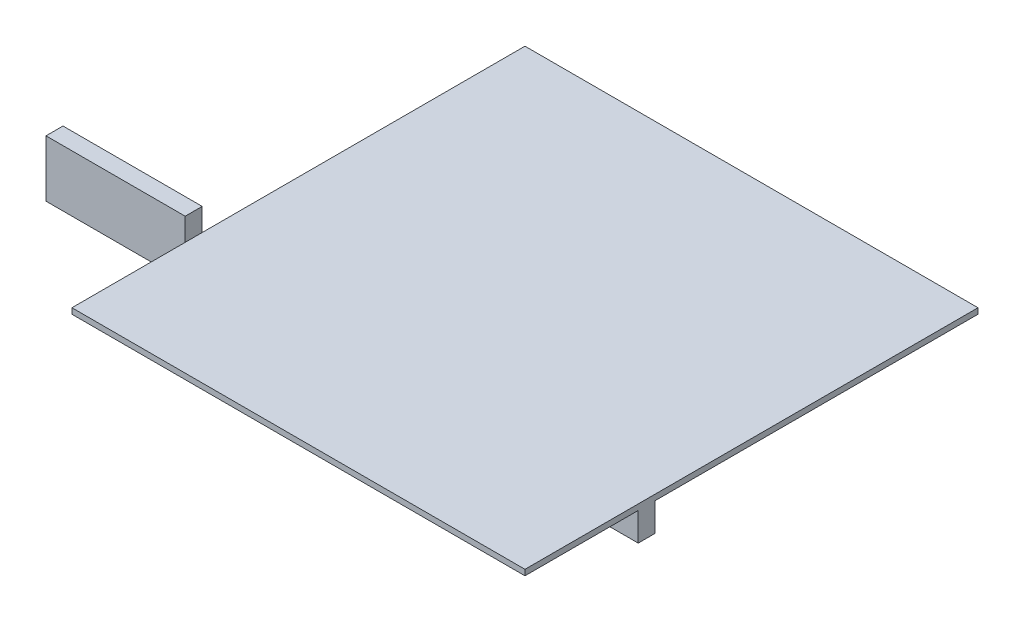
ISO-10303-21;
HEADER;
FILE_DESCRIPTION(('STEP AP214'),'2;1');
FILE_NAME('part.step','',(''),(''),'','','');
FILE_SCHEMA(('AUTOMOTIVE_DESIGN { 1 0 10303 214 1 1 1 1 }'));
ENDSEC;
DATA;
#1=APPLICATION_CONTEXT('core data for automotive mechanical design processes');
#2=APPLICATION_PROTOCOL_DEFINITION('international standard','automotive_design',2000,#1);
#3=PRODUCT_CONTEXT('',#1,'mechanical');
#4=PRODUCT('Part','Part','',(#3));
#5=PRODUCT_RELATED_PRODUCT_CATEGORY('part','',(#4));
#6=PRODUCT_DEFINITION_FORMATION('','',#4);
#7=PRODUCT_DEFINITION_CONTEXT('part definition',#1,'design');
#8=PRODUCT_DEFINITION('design','',#6,#7);
#9=PRODUCT_DEFINITION_SHAPE('','',#8);
#10=(LENGTH_UNIT() NAMED_UNIT(*) SI_UNIT(.MILLI.,.METRE.));
#11=(NAMED_UNIT(*) PLANE_ANGLE_UNIT() SI_UNIT($,.RADIAN.));
#12=(NAMED_UNIT(*) SI_UNIT($,.STERADIAN.) SOLID_ANGLE_UNIT());
#13=UNCERTAINTY_MEASURE_WITH_UNIT(LENGTH_MEASURE(1.E-05),#10,'distance_accuracy_value','');
#14=(GEOMETRIC_REPRESENTATION_CONTEXT(3) GLOBAL_UNCERTAINTY_ASSIGNED_CONTEXT((#13)) GLOBAL_UNIT_ASSIGNED_CONTEXT((#10,
#11,#12)) REPRESENTATION_CONTEXT('',''));
#15=CARTESIAN_POINT('',(0.,0.,0.));
#16=DIRECTION('',(0.,0.,1.));
#17=DIRECTION('',(1.,0.,0.));
#18=AXIS2_PLACEMENT_3D('',#15,#16,#17);
#19=CARTESIAN_POINT('',(95.5537670309781,-3.67218591091209,3.));
#20=DIRECTION('',(-1.,0.,0.));
#21=DIRECTION('',(0.,-1.,0.));
#22=AXIS2_PLACEMENT_3D('',#19,#20,#21);
#23=PLANE('',#22);
#24=DIRECTION('',(0.,1.,0.));
#25=VECTOR('',#24,1.);
#26=CARTESIAN_POINT('',(95.5537670309781,-3.67218591091209,0.));
#27=LINE('',#26,#25);
#28=CARTESIAN_POINT('',(95.5537670309781,-3.67218591091209,0.));
#29=VERTEX_POINT('',#28);
#30=CARTESIAN_POINT('',(95.5537670309781,1.32781408908791,0.));
#31=VERTEX_POINT('',#30);
#32=EDGE_CURVE('E139',#29,#31,#27,.T.);
#33=ORIENTED_EDGE('',*,*,#32,.T.);
#34=DIRECTION('',(0.,0.,-1.));
#35=VECTOR('',#34,1.);
#36=CARTESIAN_POINT('',(95.5537670309781,1.32781408908791,-57.));
#37=LINE('',#36,#35);
#38=CARTESIAN_POINT('',(95.5537670309781,1.32781408908791,-57.));
#39=VERTEX_POINT('',#38);
#40=EDGE_CURVE('E137',#31,#39,#37,.T.);
#41=ORIENTED_EDGE('',*,*,#40,.T.);
#42=DIRECTION('',(0.,-1.,0.));
#43=VECTOR('',#42,1.);
#44=CARTESIAN_POINT('',(95.5537670309781,2.32781408908791,-57.));
#45=LINE('',#44,#43);
#46=CARTESIAN_POINT('',(95.5537670309781,2.32781408908791,-57.));
#47=VERTEX_POINT('',#46);
#48=EDGE_CURVE('E118',#47,#39,#45,.T.);
#49=ORIENTED_EDGE('',*,*,#48,.F.);
#50=DIRECTION('',(0.,0.,-1.));
#51=VECTOR('',#50,1.);
#52=CARTESIAN_POINT('',(95.5537670309781,2.32781408908791,-57.));
#53=LINE('',#52,#51);
#54=CARTESIAN_POINT('',(95.5537670309781,2.32781408908791,23.));
#55=VERTEX_POINT('',#54);
#56=EDGE_CURVE('E125',#55,#47,#53,.T.);
#57=ORIENTED_EDGE('',*,*,#56,.F.);
#58=DIRECTION('',(0.,-1.,0.));
#59=VECTOR('',#58,1.);
#60=CARTESIAN_POINT('',(95.5537670309781,2.32781408908791,23.));
#61=LINE('',#60,#59);
#62=CARTESIAN_POINT('',(95.5537670309781,1.32781408908791,23.));
#63=VERTEX_POINT('',#62);
#64=EDGE_CURVE('E210',#55,#63,#61,.T.);
#65=ORIENTED_EDGE('',*,*,#64,.T.);
#66=CARTESIAN_POINT('',(95.5537670309781,1.32781408908791,3.));
#67=VERTEX_POINT('',#66);
#68=EDGE_CURVE('E211',#63,#67,#37,.T.);
#69=ORIENTED_EDGE('',*,*,#68,.T.);
#70=DIRECTION('',(0.,1.,0.));
#71=VECTOR('',#70,1.);
#72=CARTESIAN_POINT('',(95.5537670309781,-3.67218591091209,3.));
#73=LINE('',#72,#71);
#74=CARTESIAN_POINT('',(95.5537670309781,-3.67218591091209,3.));
#75=VERTEX_POINT('',#74);
#76=EDGE_CURVE('E150',#75,#67,#73,.T.);
#77=ORIENTED_EDGE('',*,*,#76,.F.);
#78=DIRECTION('',(0.,0.,-1.));
#79=VECTOR('',#78,1.);
#80=CARTESIAN_POINT('',(95.5537670309781,-3.67218591091209,3.));
#81=LINE('',#80,#79);
#82=EDGE_CURVE('E11',#75,#29,#81,.T.);
#83=ORIENTED_EDGE('',*,*,#82,.T.);
#84=EDGE_LOOP('',(#33,#41,#49,#57,#65,#69,#77,#83));
#85=FACE_BOUND('',#84,.T.);
#86=ADVANCED_FACE('F33',(#85),#23,.F.);
#87=CARTESIAN_POINT('',(15.5537670309781,1.32781408908791,3.));
#88=DIRECTION('',(-1.,0.,0.));
#89=DIRECTION('',(0.,-1.,0.));
#90=AXIS2_PLACEMENT_3D('',#87,#88,#89);
#91=PLANE('',#90);
#92=DIRECTION('',(0.,1.,0.));
#93=VECTOR('',#92,1.);
#94=CARTESIAN_POINT('',(15.5537670309781,1.32781408908791,3.));
#95=LINE('',#94,#93);
#96=CARTESIAN_POINT('',(15.5537670309781,2.32781408908791,3.));
#97=VERTEX_POINT('',#96);
#98=CARTESIAN_POINT('',(15.5537670309781,6.32781408908791,3.));
#99=VERTEX_POINT('',#98);
#100=EDGE_CURVE('E47',#97,#99,#95,.T.);
#101=ORIENTED_EDGE('',*,*,#100,.F.);
#102=DIRECTION('',(0.,0.,1.));
#103=VECTOR('',#102,1.);
#104=CARTESIAN_POINT('',(15.5537670309781,2.32781408908791,-57.));
#105=LINE('',#104,#103);
#106=CARTESIAN_POINT('',(15.5537670309781,2.32781408908791,0.));
#107=VERTEX_POINT('',#106);
#108=EDGE_CURVE('E52',#107,#97,#105,.T.);
#109=ORIENTED_EDGE('',*,*,#108,.F.);
#110=DIRECTION('',(0.,1.,0.));
#111=VECTOR('',#110,1.);
#112=CARTESIAN_POINT('',(15.5537670309781,1.32781408908791,0.));
#113=LINE('',#112,#111);
#114=CARTESIAN_POINT('',(15.5537670309781,6.32781408908791,0.));
#115=VERTEX_POINT('',#114);
#116=EDGE_CURVE('E165',#107,#115,#113,.T.);
#117=ORIENTED_EDGE('',*,*,#116,.T.);
#118=DIRECTION('',(0.,0.,-1.));
#119=VECTOR('',#118,1.);
#120=CARTESIAN_POINT('',(15.5537670309781,6.32781408908791,3.));
#121=LINE('',#120,#119);
#122=EDGE_CURVE('E40',#99,#115,#121,.T.);
#123=ORIENTED_EDGE('',*,*,#122,.F.);
#124=EDGE_LOOP('',(#101,#109,#117,#123));
#125=FACE_BOUND('',#124,.T.);
#126=ADVANCED_FACE('F245',(#125),#91,.F.);
#127=CARTESIAN_POINT('',(-9.02623296902192,6.32781408908791,3.));
#128=DIRECTION('',(0.,-1.,0.));
#129=DIRECTION('',(0.,0.,-1.));
#130=AXIS2_PLACEMENT_3D('',#127,#128,#129);
#131=PLANE('',#130);
#132=DIRECTION('',(-1.,0.,0.));
#133=VECTOR('',#132,1.);
#134=CARTESIAN_POINT('',(-9.02623296902192,6.32781408908791,0.));
#135=LINE('',#134,#133);
#136=CARTESIAN_POINT('',(-9.02623296902192,6.32781408908791,0.));
#137=VERTEX_POINT('',#136);
#138=EDGE_CURVE('E169',#115,#137,#135,.T.);
#139=ORIENTED_EDGE('',*,*,#138,.T.);
#140=DIRECTION('',(0.,0.,-1.));
#141=VECTOR('',#140,1.);
#142=CARTESIAN_POINT('',(-9.02623296902192,6.32781408908791,3.));
#143=LINE('',#142,#141);
#144=CARTESIAN_POINT('',(-9.02623296902192,6.32781408908791,3.));
#145=VERTEX_POINT('',#144);
#146=EDGE_CURVE('E176',#145,#137,#143,.T.);
#147=ORIENTED_EDGE('',*,*,#146,.F.);
#148=DIRECTION('',(-1.,0.,0.));
#149=VECTOR('',#148,1.);
#150=CARTESIAN_POINT('',(-9.02623296902192,6.32781408908791,3.));
#151=LINE('',#150,#149);
#152=EDGE_CURVE('E157',#99,#145,#151,.T.);
#153=ORIENTED_EDGE('',*,*,#152,.F.);
#154=ORIENTED_EDGE('',*,*,#122,.T.);
#155=EDGE_LOOP('',(#139,#147,#153,#154));
#156=FACE_BOUND('',#155,.T.);
#157=ADVANCED_FACE('F182',(#156),#131,.F.);
#158=CARTESIAN_POINT('',(-9.02623296902192,6.32781408908791,3.));
#159=DIRECTION('',(1.,0.,0.));
#160=DIRECTION('',(0.,0.,-1.));
#161=AXIS2_PLACEMENT_3D('',#158,#159,#160);
#162=PLANE('',#161);
#163=DIRECTION('',(0.,-1.,0.));
#164=VECTOR('',#163,1.);
#165=CARTESIAN_POINT('',(-9.02623296902192,6.32781408908791,0.));
#166=LINE('',#165,#164);
#167=CARTESIAN_POINT('',(-9.02623296902192,-3.67218591091209,0.));
#168=VERTEX_POINT('',#167);
#169=EDGE_CURVE('E171',#137,#168,#166,.T.);
#170=ORIENTED_EDGE('',*,*,#169,.T.);
#171=DIRECTION('',(0.,0.,-1.));
#172=VECTOR('',#171,1.);
#173=CARTESIAN_POINT('',(-9.02623296902192,-3.67218591091209,3.));
#174=LINE('',#173,#172);
#175=CARTESIAN_POINT('',(-9.02623296902192,-3.67218591091209,3.));
#176=VERTEX_POINT('',#175);
#177=EDGE_CURVE('E161',#176,#168,#174,.T.);
#178=ORIENTED_EDGE('',*,*,#177,.F.);
#179=DIRECTION('',(0.,-1.,0.));
#180=VECTOR('',#179,1.);
#181=CARTESIAN_POINT('',(-9.02623296902192,6.32781408908791,3.));
#182=LINE('',#181,#180);
#183=EDGE_CURVE('E159',#145,#176,#182,.T.);
#184=ORIENTED_EDGE('',*,*,#183,.F.);
#185=ORIENTED_EDGE('',*,*,#146,.T.);
#186=EDGE_LOOP('',(#170,#178,#184,#185));
#187=FACE_BOUND('',#186,.T.);
#188=ADVANCED_FACE('F191',(#187),#162,.F.);
#189=CARTESIAN_POINT('',(-9.02623296902192,-3.67218591091209,3.));
#190=DIRECTION('',(0.,1.,0.));
#191=DIRECTION('',(-1.,0.,0.));
#192=AXIS2_PLACEMENT_3D('',#189,#190,#191);
#193=PLANE('',#192);
#194=DIRECTION('',(1.,0.,0.));
#195=VECTOR('',#194,1.);
#196=CARTESIAN_POINT('',(-9.02623296902192,-3.67218591091209,0.));
#197=LINE('',#196,#195);
#198=EDGE_CURVE('E151',#168,#29,#197,.T.);
#199=ORIENTED_EDGE('',*,*,#198,.T.);
#200=ORIENTED_EDGE('',*,*,#82,.F.);
#201=DIRECTION('',(1.,0.,0.));
#202=VECTOR('',#201,1.);
#203=CARTESIAN_POINT('',(5.23814465323999,-3.67218591091209,3.));
#204=LINE('',#203,#202);
#205=EDGE_CURVE('E147',#176,#75,#204,.T.);
#206=ORIENTED_EDGE('',*,*,#205,.F.);
#207=ORIENTED_EDGE('',*,*,#177,.T.);
#208=EDGE_LOOP('',(#199,#200,#206,#207));
#209=FACE_BOUND('',#208,.T.);
#210=ADVANCED_FACE('F194',(#209),#193,.F.);
#211=CARTESIAN_POINT('',(0.,0.,3.));
#212=DIRECTION('',(0.,0.,1.));
#213=DIRECTION('',(1.,0.,0.));
#214=AXIS2_PLACEMENT_3D('',#211,#212,#213);
#215=PLANE('',#214);
#216=ORIENTED_EDGE('',*,*,#205,.T.);
#217=ORIENTED_EDGE('',*,*,#76,.T.);
#218=DIRECTION('',(-1.,0.,0.));
#219=VECTOR('',#218,1.);
#220=CARTESIAN_POINT('',(15.5537670309781,1.32781408908791,3.));
#221=LINE('',#220,#219);
#222=CARTESIAN_POINT('',(15.5537670309781,1.32781408908791,3.));
#223=VERTEX_POINT('',#222);
#224=EDGE_CURVE('E153',#67,#223,#221,.T.);
#225=ORIENTED_EDGE('',*,*,#224,.T.);
#226=EDGE_CURVE('E155',#223,#97,#95,.T.);
#227=ORIENTED_EDGE('',*,*,#226,.T.);
#228=ORIENTED_EDGE('',*,*,#100,.T.);
#229=ORIENTED_EDGE('',*,*,#152,.T.);
#230=ORIENTED_EDGE('',*,*,#183,.T.);
#231=EDGE_LOOP('',(#216,#217,#225,#227,#228,#229,#230));
#232=FACE_BOUND('',#231,.T.);
#233=ADVANCED_FACE('F197',(#232),#215,.T.);
#234=CARTESIAN_POINT('',(0.,0.,0.));
#235=DIRECTION('',(0.,0.,1.));
#236=DIRECTION('',(1.,0.,0.));
#237=AXIS2_PLACEMENT_3D('',#234,#235,#236);
#238=PLANE('',#237);
#239=ORIENTED_EDGE('',*,*,#32,.F.);
#240=ORIENTED_EDGE('',*,*,#198,.F.);
#241=ORIENTED_EDGE('',*,*,#169,.F.);
#242=ORIENTED_EDGE('',*,*,#138,.F.);
#243=ORIENTED_EDGE('',*,*,#116,.F.);
#244=CARTESIAN_POINT('',(15.5537670309781,1.32781408908791,0.));
#245=VERTEX_POINT('',#244);
#246=EDGE_CURVE('E166',#245,#107,#113,.T.);
#247=ORIENTED_EDGE('',*,*,#246,.F.);
#248=DIRECTION('',(-1.,0.,0.));
#249=VECTOR('',#248,1.);
#250=CARTESIAN_POINT('',(15.5537670309781,1.32781408908791,0.));
#251=LINE('',#250,#249);
#252=EDGE_CURVE('E141',#31,#245,#251,.T.);
#253=ORIENTED_EDGE('',*,*,#252,.F.);
#254=EDGE_LOOP('',(#239,#240,#241,#242,#243,#247,#253));
#255=FACE_BOUND('',#254,.T.);
#256=ADVANCED_FACE('F187',(#255),#238,.F.);
#257=CARTESIAN_POINT('',(15.5537670309781,2.32781408908791,-57.));
#258=DIRECTION('',(1.,0.,0.));
#259=DIRECTION('',(0.,0.,-1.));
#260=AXIS2_PLACEMENT_3D('',#257,#258,#259);
#261=PLANE('',#260);
#262=DIRECTION('',(0.,0.,1.));
#263=VECTOR('',#262,1.);
#264=CARTESIAN_POINT('',(15.5537670309781,1.32781408908791,-57.));
#265=LINE('',#264,#263);
#266=CARTESIAN_POINT('',(15.5537670309781,1.32781408908791,-57.));
#267=VERTEX_POINT('',#266);
#268=EDGE_CURVE('E217',#267,#245,#265,.T.);
#269=ORIENTED_EDGE('',*,*,#268,.T.);
#270=ORIENTED_EDGE('',*,*,#246,.T.);
#271=CARTESIAN_POINT('',(15.5537670309781,2.32781408908791,-57.));
#272=VERTEX_POINT('',#271);
#273=EDGE_CURVE('E207',#272,#107,#105,.T.);
#274=ORIENTED_EDGE('',*,*,#273,.F.);
#275=DIRECTION('',(0.,-1.,0.));
#276=VECTOR('',#275,1.);
#277=CARTESIAN_POINT('',(15.5537670309781,2.32781408908791,-57.));
#278=LINE('',#277,#276);
#279=EDGE_CURVE('E120',#272,#267,#278,.T.);
#280=ORIENTED_EDGE('',*,*,#279,.T.);
#281=EDGE_LOOP('',(#269,#270,#274,#280));
#282=FACE_BOUND('',#281,.T.);
#283=ADVANCED_FACE('F232',(#282),#261,.F.);
#284=CARTESIAN_POINT('',(0.,1.32781408908791,0.));
#285=DIRECTION('',(0.,1.,0.));
#286=DIRECTION('',(0.,0.,1.));
#287=AXIS2_PLACEMENT_3D('',#284,#285,#286);
#288=PLANE('',#287);
#289=ORIENTED_EDGE('',*,*,#40,.F.);
#290=ORIENTED_EDGE('',*,*,#252,.T.);
#291=ORIENTED_EDGE('',*,*,#268,.F.);
#292=DIRECTION('',(-1.,0.,0.));
#293=VECTOR('',#292,1.);
#294=CARTESIAN_POINT('',(15.5537670309781,1.32781408908791,-57.));
#295=LINE('',#294,#293);
#296=EDGE_CURVE('E214',#39,#267,#295,.T.);
#297=ORIENTED_EDGE('',*,*,#296,.F.);
#298=EDGE_LOOP('',(#289,#290,#291,#297));
#299=FACE_BOUND('',#298,.T.);
#300=ADVANCED_FACE('F230',(#299),#288,.F.);
#301=CARTESIAN_POINT('',(15.5537670309781,2.32781408908791,-57.));
#302=DIRECTION('',(0.,0.,1.));
#303=DIRECTION('',(1.,0.,0.));
#304=AXIS2_PLACEMENT_3D('',#301,#302,#303);
#305=PLANE('',#304);
#306=ORIENTED_EDGE('',*,*,#296,.T.);
#307=ORIENTED_EDGE('',*,*,#279,.F.);
#308=DIRECTION('',(-1.,0.,0.));
#309=VECTOR('',#308,1.);
#310=CARTESIAN_POINT('',(15.5537670309781,2.32781408908791,-57.));
#311=LINE('',#310,#309);
#312=EDGE_CURVE('E114',#47,#272,#311,.T.);
#313=ORIENTED_EDGE('',*,*,#312,.F.);
#314=ORIENTED_EDGE('',*,*,#48,.T.);
#315=EDGE_LOOP('',(#306,#307,#313,#314));
#316=FACE_BOUND('',#315,.T.);
#317=ADVANCED_FACE('F116',(#316),#305,.F.);
#318=ORIENTED_EDGE('',*,*,#226,.F.);
#319=CARTESIAN_POINT('',(15.5537670309781,1.32781408908791,23.));
#320=VERTEX_POINT('',#319);
#321=EDGE_CURVE('E216',#223,#320,#265,.T.);
#322=ORIENTED_EDGE('',*,*,#321,.T.);
#323=DIRECTION('',(0.,-1.,0.));
#324=VECTOR('',#323,1.);
#325=CARTESIAN_POINT('',(15.5537670309781,2.32781408908791,23.));
#326=LINE('',#325,#324);
#327=CARTESIAN_POINT('',(15.5537670309781,2.32781408908791,23.));
#328=VERTEX_POINT('',#327);
#329=EDGE_CURVE('E143',#328,#320,#326,.T.);
#330=ORIENTED_EDGE('',*,*,#329,.F.);
#331=EDGE_CURVE('E124',#97,#328,#105,.T.);
#332=ORIENTED_EDGE('',*,*,#331,.F.);
#333=EDGE_LOOP('',(#318,#322,#330,#332));
#334=FACE_BOUND('',#333,.T.);
#335=ADVANCED_FACE('F204',(#334),#261,.F.);
#336=CARTESIAN_POINT('',(15.5537670309781,2.32781408908791,23.));
#337=DIRECTION('',(0.,0.,-1.));
#338=DIRECTION('',(-1.,0.,0.));
#339=AXIS2_PLACEMENT_3D('',#336,#337,#338);
#340=PLANE('',#339);
#341=DIRECTION('',(1.,0.,0.));
#342=VECTOR('',#341,1.);
#343=CARTESIAN_POINT('',(15.5537670309781,1.32781408908791,23.));
#344=LINE('',#343,#342);
#345=EDGE_CURVE('E134',#320,#63,#344,.T.);
#346=ORIENTED_EDGE('',*,*,#345,.T.);
#347=ORIENTED_EDGE('',*,*,#64,.F.);
#348=DIRECTION('',(1.,0.,0.));
#349=VECTOR('',#348,1.);
#350=CARTESIAN_POINT('',(15.5537670309781,2.32781408908791,23.));
#351=LINE('',#350,#349);
#352=EDGE_CURVE('E130',#328,#55,#351,.T.);
#353=ORIENTED_EDGE('',*,*,#352,.F.);
#354=ORIENTED_EDGE('',*,*,#329,.T.);
#355=EDGE_LOOP('',(#346,#347,#353,#354));
#356=FACE_BOUND('',#355,.T.);
#357=ADVANCED_FACE('F223',(#356),#340,.F.);
#358=CARTESIAN_POINT('',(0.,2.32781408908791,0.));
#359=DIRECTION('',(0.,1.,0.));
#360=DIRECTION('',(0.,0.,1.));
#361=AXIS2_PLACEMENT_3D('',#358,#359,#360);
#362=PLANE('',#361);
#363=ORIENTED_EDGE('',*,*,#56,.T.);
#364=ORIENTED_EDGE('',*,*,#312,.T.);
#365=ORIENTED_EDGE('',*,*,#273,.T.);
#366=ORIENTED_EDGE('',*,*,#108,.T.);
#367=ORIENTED_EDGE('',*,*,#331,.T.);
#368=ORIENTED_EDGE('',*,*,#352,.T.);
#369=EDGE_LOOP('',(#363,#364,#365,#366,#367,#368));
#370=FACE_BOUND('',#369,.T.);
#371=ADVANCED_FACE('F128',(#370),#362,.T.);
#372=ORIENTED_EDGE('',*,*,#224,.F.);
#373=ORIENTED_EDGE('',*,*,#68,.F.);
#374=ORIENTED_EDGE('',*,*,#345,.F.);
#375=ORIENTED_EDGE('',*,*,#321,.F.);
#376=EDGE_LOOP('',(#372,#373,#374,#375));
#377=FACE_BOUND('',#376,.T.);
#378=ADVANCED_FACE('F226',(#377),#288,.F.);
#379=CLOSED_SHELL('',(#86,#126,#157,#188,#210,#233,#256,#283,#300,#317,#335,#357,#371,#378));
#380=MANIFOLD_SOLID_BREP('B2',#379);
#381=ADVANCED_BREP_SHAPE_REPRESENTATION('',(#18,#380),#14);
#382=SHAPE_DEFINITION_REPRESENTATION(#9,#381);
ENDSEC;
END-ISO-10303-21;
